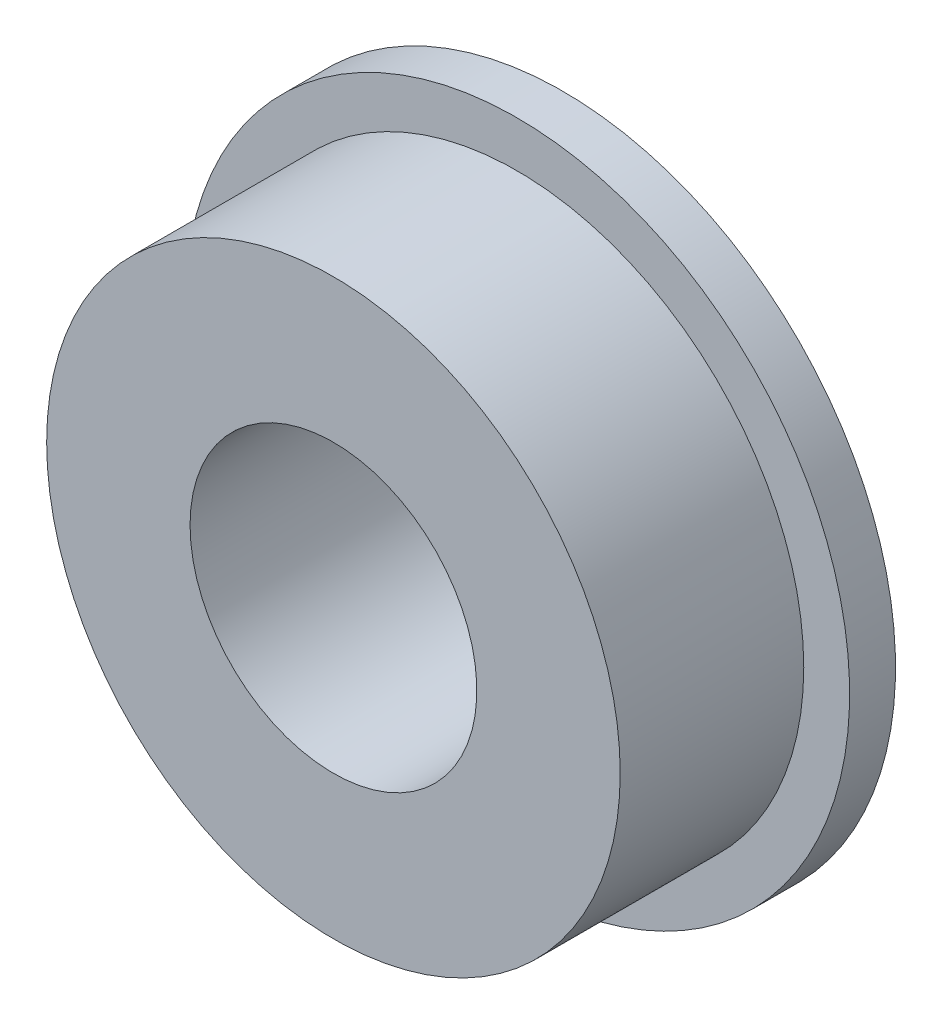
ISO-10303-21;
HEADER;
FILE_DESCRIPTION(('STEP AP214'),'2;1');
FILE_NAME('part.step','',(''),(''),'','','');
FILE_SCHEMA(('AUTOMOTIVE_DESIGN { 1 0 10303 214 1 1 1 1 }'));
ENDSEC;
DATA;
#1=APPLICATION_CONTEXT('core data for automotive mechanical design processes');
#2=APPLICATION_PROTOCOL_DEFINITION('international standard','automotive_design',2000,#1);
#3=PRODUCT_CONTEXT('',#1,'mechanical');
#4=PRODUCT('Part','Part','',(#3));
#5=PRODUCT_RELATED_PRODUCT_CATEGORY('part','',(#4));
#6=PRODUCT_DEFINITION_FORMATION('','',#4);
#7=PRODUCT_DEFINITION_CONTEXT('part definition',#1,'design');
#8=PRODUCT_DEFINITION('design','',#6,#7);
#9=PRODUCT_DEFINITION_SHAPE('','',#8);
#10=(LENGTH_UNIT() NAMED_UNIT(*) SI_UNIT(.MILLI.,.METRE.));
#11=(NAMED_UNIT(*) PLANE_ANGLE_UNIT() SI_UNIT($,.RADIAN.));
#12=(NAMED_UNIT(*) SI_UNIT($,.STERADIAN.) SOLID_ANGLE_UNIT());
#13=UNCERTAINTY_MEASURE_WITH_UNIT(LENGTH_MEASURE(1.E-05),#10,'distance_accuracy_value','');
#14=(GEOMETRIC_REPRESENTATION_CONTEXT(3) GLOBAL_UNCERTAINTY_ASSIGNED_CONTEXT((#13)) GLOBAL_UNIT_ASSIGNED_CONTEXT((#10,
#11,#12)) REPRESENTATION_CONTEXT('',''));
#15=CARTESIAN_POINT('',(0.,0.,0.));
#16=DIRECTION('',(0.,0.,1.));
#17=DIRECTION('',(1.,0.,0.));
#18=AXIS2_PLACEMENT_3D('',#15,#16,#17);
#19=CARTESIAN_POINT('',(0.,0.,4.));
#20=DIRECTION('',(0.,0.,-1.));
#21=DIRECTION('',(-1.,0.,0.));
#22=AXIS2_PLACEMENT_3D('',#19,#20,#21);
#23=CYLINDRICAL_SURFACE('',#22,5.);
#24=CARTESIAN_POINT('',(0.,0.,4.));
#25=DIRECTION('',(0.,0.,1.));
#26=DIRECTION('',(1.,0.,0.));
#27=AXIS2_PLACEMENT_3D('',#24,#25,#26);
#28=CIRCLE('',#27,5.);
#29=CARTESIAN_POINT('',(5.,0.,4.));
#30=VERTEX_POINT('',#29);
#31=EDGE_CURVE('E42',#30,#30,#28,.T.);
#32=ORIENTED_EDGE('',*,*,#31,.F.);
#33=EDGE_LOOP('',(#32));
#34=FACE_BOUND('',#33,.T.);
#35=CARTESIAN_POINT('',(0.,0.,0.8));
#36=DIRECTION('',(0.,0.,-1.));
#37=DIRECTION('',(-1.,0.,0.));
#38=AXIS2_PLACEMENT_3D('',#35,#36,#37);
#39=CIRCLE('',#38,5.);
#40=CARTESIAN_POINT('',(-5.,0.,0.8));
#41=VERTEX_POINT('',#40);
#42=EDGE_CURVE('E10',#41,#41,#39,.T.);
#43=ORIENTED_EDGE('',*,*,#42,.F.);
#44=EDGE_LOOP('',(#43));
#45=FACE_BOUND('',#44,.T.);
#46=ADVANCED_FACE('F36',(#34,#45),#23,.T.);
#47=CARTESIAN_POINT('',(0.,0.,4.));
#48=DIRECTION('',(0.,0.,1.));
#49=DIRECTION('',(1.,0.,0.));
#50=AXIS2_PLACEMENT_3D('',#47,#48,#49);
#51=PLANE('',#50);
#52=CARTESIAN_POINT('',(0.,0.,4.));
#53=DIRECTION('',(0.,0.,-1.));
#54=DIRECTION('',(-1.,0.,0.));
#55=AXIS2_PLACEMENT_3D('',#52,#53,#54);
#56=CIRCLE('',#55,2.5);
#57=CARTESIAN_POINT('',(-2.5,0.,4.));
#58=VERTEX_POINT('',#57);
#59=EDGE_CURVE('E54',#58,#58,#56,.T.);
#60=ORIENTED_EDGE('',*,*,#59,.T.);
#61=EDGE_LOOP('',(#60));
#62=FACE_BOUND('',#61,.T.);
#63=ORIENTED_EDGE('',*,*,#31,.T.);
#64=EDGE_LOOP('',(#63));
#65=FACE_BOUND('',#64,.T.);
#66=ADVANCED_FACE('F62',(#62,#65),#51,.T.);
#67=CARTESIAN_POINT('',(0.,0.,0.8));
#68=DIRECTION('',(0.,0.,-1.));
#69=DIRECTION('',(-1.,0.,0.));
#70=AXIS2_PLACEMENT_3D('',#67,#68,#69);
#71=CYLINDRICAL_SURFACE('',#70,5.8);
#72=CARTESIAN_POINT('',(0.,0.,0.8));
#73=DIRECTION('',(0.,0.,-1.));
#74=DIRECTION('',(-1.,0.,0.));
#75=AXIS2_PLACEMENT_3D('',#72,#73,#74);
#76=CIRCLE('',#75,5.8);
#77=CARTESIAN_POINT('',(-5.8,0.,0.8));
#78=VERTEX_POINT('',#77);
#79=EDGE_CURVE('E46',#78,#78,#76,.T.);
#80=ORIENTED_EDGE('',*,*,#79,.T.);
#81=EDGE_LOOP('',(#80));
#82=FACE_BOUND('',#81,.T.);
#83=CARTESIAN_POINT('',(0.,0.,0.));
#84=DIRECTION('',(0.,0.,-1.));
#85=DIRECTION('',(-1.,0.,0.));
#86=AXIS2_PLACEMENT_3D('',#83,#84,#85);
#87=CIRCLE('',#86,5.8);
#88=CARTESIAN_POINT('',(-5.8,0.,0.));
#89=VERTEX_POINT('',#88);
#90=EDGE_CURVE('E50',#89,#89,#87,.T.);
#91=ORIENTED_EDGE('',*,*,#90,.F.);
#92=EDGE_LOOP('',(#91));
#93=FACE_BOUND('',#92,.T.);
#94=ADVANCED_FACE('F76',(#82,#93),#71,.T.);
#95=CARTESIAN_POINT('',(0.,0.,0.8));
#96=DIRECTION('',(0.,0.,-1.));
#97=DIRECTION('',(-1.,0.,0.));
#98=AXIS2_PLACEMENT_3D('',#95,#96,#97);
#99=PLANE('',#98);
#100=ORIENTED_EDGE('',*,*,#42,.T.);
#101=EDGE_LOOP('',(#100));
#102=FACE_BOUND('',#101,.T.);
#103=ORIENTED_EDGE('',*,*,#79,.F.);
#104=EDGE_LOOP('',(#103));
#105=FACE_BOUND('',#104,.T.);
#106=ADVANCED_FACE('F73',(#102,#105),#99,.F.);
#107=CARTESIAN_POINT('',(0.,0.,0.));
#108=DIRECTION('',(0.,0.,1.));
#109=DIRECTION('',(1.,0.,0.));
#110=AXIS2_PLACEMENT_3D('',#107,#108,#109);
#111=PLANE('',#110);
#112=CARTESIAN_POINT('',(0.,0.,0.));
#113=DIRECTION('',(0.,0.,-1.));
#114=DIRECTION('',(-1.,0.,0.));
#115=AXIS2_PLACEMENT_3D('',#112,#113,#114);
#116=CIRCLE('',#115,2.5);
#117=CARTESIAN_POINT('',(-2.5,0.,0.));
#118=VERTEX_POINT('',#117);
#119=EDGE_CURVE('E56',#118,#118,#116,.T.);
#120=ORIENTED_EDGE('',*,*,#119,.F.);
#121=EDGE_LOOP('',(#120));
#122=FACE_BOUND('',#121,.T.);
#123=ORIENTED_EDGE('',*,*,#90,.T.);
#124=EDGE_LOOP('',(#123));
#125=FACE_BOUND('',#124,.T.);
#126=ADVANCED_FACE('F67',(#122,#125),#111,.F.);
#127=CARTESIAN_POINT('',(0.,0.,4.));
#128=DIRECTION('',(0.,0.,-1.));
#129=DIRECTION('',(-1.,0.,0.));
#130=AXIS2_PLACEMENT_3D('',#127,#128,#129);
#131=CYLINDRICAL_SURFACE('',#130,2.5);
#132=ORIENTED_EDGE('',*,*,#59,.F.);
#133=EDGE_LOOP('',(#132));
#134=FACE_BOUND('',#133,.T.);
#135=ORIENTED_EDGE('',*,*,#119,.T.);
#136=EDGE_LOOP('',(#135));
#137=FACE_BOUND('',#136,.T.);
#138=ADVANCED_FACE('F64',(#134,#137),#131,.F.);
#139=CLOSED_SHELL('',(#46,#66,#94,#106,#126,#138));
#140=MANIFOLD_SOLID_BREP('B2',#139);
#141=ADVANCED_BREP_SHAPE_REPRESENTATION('',(#18,#140),#14);
#142=SHAPE_DEFINITION_REPRESENTATION(#9,#141);
ENDSEC;
END-ISO-10303-21;
